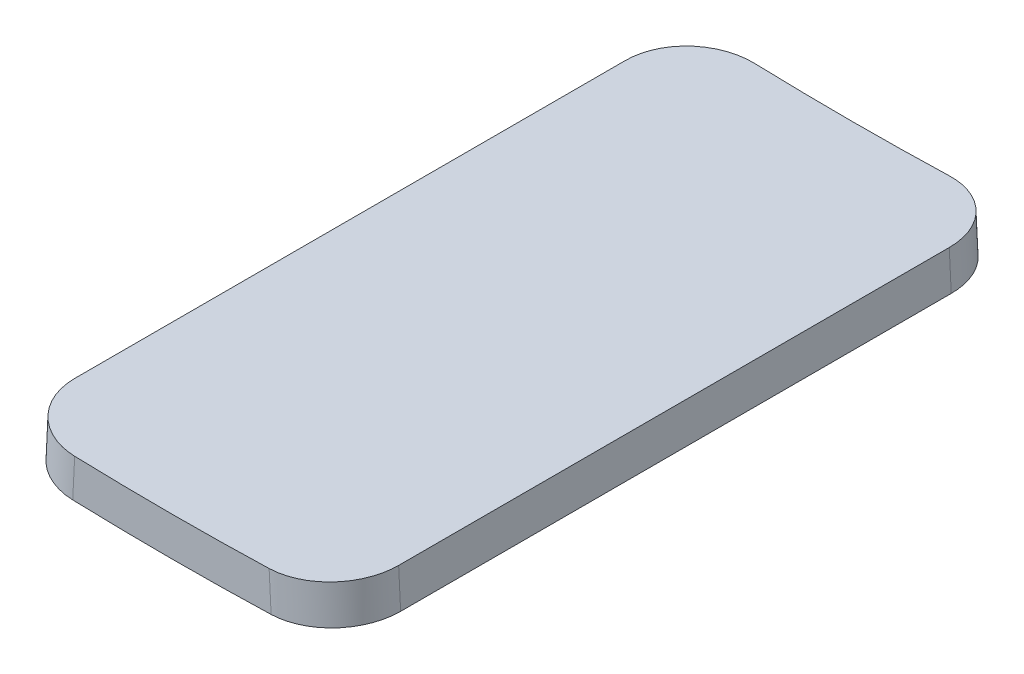
ISO-10303-21;
HEADER;
FILE_DESCRIPTION(('STEP AP214'),'2;1');
FILE_NAME('part.step','',(''),(''),'','','');
FILE_SCHEMA(('AUTOMOTIVE_DESIGN { 1 0 10303 214 1 1 1 1 }'));
ENDSEC;
DATA;
#1=APPLICATION_CONTEXT('core data for automotive mechanical design processes');
#2=APPLICATION_PROTOCOL_DEFINITION('international standard','automotive_design',2000,#1);
#3=PRODUCT_CONTEXT('',#1,'mechanical');
#4=PRODUCT('Part','Part','',(#3));
#5=PRODUCT_RELATED_PRODUCT_CATEGORY('part','',(#4));
#6=PRODUCT_DEFINITION_FORMATION('','',#4);
#7=PRODUCT_DEFINITION_CONTEXT('part definition',#1,'design');
#8=PRODUCT_DEFINITION('design','',#6,#7);
#9=PRODUCT_DEFINITION_SHAPE('','',#8);
#10=(LENGTH_UNIT() NAMED_UNIT(*) SI_UNIT(.MILLI.,.METRE.));
#11=(NAMED_UNIT(*) PLANE_ANGLE_UNIT() SI_UNIT($,.RADIAN.));
#12=(NAMED_UNIT(*) SI_UNIT($,.STERADIAN.) SOLID_ANGLE_UNIT());
#13=UNCERTAINTY_MEASURE_WITH_UNIT(LENGTH_MEASURE(1.E-05),#10,'distance_accuracy_value','');
#14=(GEOMETRIC_REPRESENTATION_CONTEXT(3) GLOBAL_UNCERTAINTY_ASSIGNED_CONTEXT((#13)) GLOBAL_UNIT_ASSIGNED_CONTEXT((#10,
#11,#12)) REPRESENTATION_CONTEXT('',''));
#15=CARTESIAN_POINT('',(0.,0.,0.));
#16=DIRECTION('',(0.,0.,1.));
#17=DIRECTION('',(1.,0.,0.));
#18=AXIS2_PLACEMENT_3D('',#15,#16,#17);
#19=CARTESIAN_POINT('',(0.,0.,105.));
#20=DIRECTION('',(0.,0.,-1.));
#21=DIRECTION('',(-1.,0.,0.));
#22=AXIS2_PLACEMENT_3D('',#19,#20,#21);
#23=CYLINDRICAL_SURFACE('',#22,989.5);
#24=DIRECTION('',(0.,0.,-1.));
#25=VECTOR('',#24,1.);
#26=CARTESIAN_POINT('',(-50.6138107416881,-988.204681309598,105.));
#27=LINE('',#26,#25);
#28=CARTESIAN_POINT('',(-50.6138107416881,-988.204681309598,85.));
#29=VERTEX_POINT('',#28);
#30=CARTESIAN_POINT('',(-50.6138107416881,-988.204681309598,-85.));
#31=VERTEX_POINT('',#30);
#32=EDGE_CURVE('E107',#29,#31,#27,.T.);
#33=ORIENTED_EDGE('',*,*,#32,.T.);
#34=CARTESIAN_POINT('',(-50.6138107416881,-988.204681309598,-85.));
#35=CARTESIAN_POINT('',(-50.6138110743106,-988.204681120901,-85.2812811827756));
#36=CARTESIAN_POINT('',(-50.6078838693653,-988.20498489261,-85.5625310707984));
#37=CARTESIAN_POINT('',(-50.5841914306772,-988.206198008476,-86.1245237497624));
#38=CARTESIAN_POINT('',(-50.566426479175,-988.207107338196,-86.4052665526338));
#39=CARTESIAN_POINT('',(-50.4954123886573,-988.210739537763,-87.2459428356075));
#40=CARTESIAN_POINT('',(-50.4244439947445,-988.214366620417,-87.8044700598129));
#41=CARTESIAN_POINT('',(-50.2358062973874,-988.223973933409,-88.9131267922659));
#42=CARTESIAN_POINT('',(-50.1181722773639,-988.229952385869,-89.4632623197968));
#43=CARTESIAN_POINT('',(-49.9073880214237,-988.240612136683,-90.2794063060949));
#44=CARTESIAN_POINT('',(-49.8314005890525,-988.244447590418,-90.5499552954991));
#45=CARTESIAN_POINT('',(-49.6680894953054,-988.252668894439,-91.0876771948021));
#46=CARTESIAN_POINT('',(-49.5807629334669,-988.257054885539,-91.354849221646));
#47=CARTESIAN_POINT('',(-49.3019621402565,-988.271016124019,-92.1506394129465));
#48=CARTESIAN_POINT('',(-49.0936861529881,-988.281393653225,-92.6734567905683));
#49=CARTESIAN_POINT('',(-48.6338593197196,-988.304128618946,-93.6996564824725));
#50=CARTESIAN_POINT('',(-48.3823084690021,-988.316486055676,-94.2030387946362));
#51=CARTESIAN_POINT('',(-47.9739545152395,-988.336363903036,-94.9407437770858));
#52=CARTESIAN_POINT('',(-47.8326513980132,-988.343214131934,-95.1837713908905));
#53=CARTESIAN_POINT('',(-47.5399753663873,-988.357335284709,-95.6635855702672));
#54=CARTESIAN_POINT('',(-47.3886050405922,-988.364606100377,-95.9003737185106));
#55=CARTESIAN_POINT('',(-46.9197003137813,-988.387014118973,-96.6008735043053));
#56=CARTESIAN_POINT('',(-46.5873449648487,-988.402748222839,-97.0547696039536));
#57=CARTESIAN_POINT('',(-45.885657051421,-988.43557189798,-97.9328486083196));
#58=CARTESIAN_POINT('',(-45.5163254773655,-988.452661432947,-98.3570323083921));
#59=CARTESIAN_POINT('',(-44.7432469406756,-988.487957196483,-99.1727665938462));
#60=CARTESIAN_POINT('',(-44.3394997948698,-988.506163430996,-99.5643170055204));
#61=CARTESIAN_POINT('',(-43.5003861337522,-988.543445061462,-100.312052020984));
#62=CARTESIAN_POINT('',(-43.0650133305269,-988.562520629978,-100.668229558319));
#63=CARTESIAN_POINT('',(-42.1658142487429,-988.601282910376,-101.342597906165));
#64=CARTESIAN_POINT('',(-41.7019884094727,-988.620969612821,-101.660789302922));
#65=CARTESIAN_POINT('',(-40.7491259768812,-988.660703224017,-102.256957918585));
#66=CARTESIAN_POINT('',(-40.2600868504971,-988.680750168828,-102.53493108623));
#67=CARTESIAN_POINT('',(-39.2602804586776,-988.720956916257,-103.048666050341));
#68=CARTESIAN_POINT('',(-38.749511864824,-988.741116725711,-103.284425261479));
#69=CARTESIAN_POINT('',(-37.7101813676001,-988.781301684371,-103.711927208893));
#70=CARTESIAN_POINT('',(-37.181628407264,-988.801326895359,-103.903691699949));
#71=CARTESIAN_POINT('',(-36.1103063080912,-988.841030131255,-104.241963788748));
#72=CARTESIAN_POINT('',(-35.5675406158332,-988.860708238433,-104.388482250368));
#73=CARTESIAN_POINT('',(-34.6595515354752,-988.892863524383,-104.59296020923));
#74=CARTESIAN_POINT('',(-34.2972354563729,-988.905497177651,-104.664060834218));
#75=CARTESIAN_POINT('',(-33.569217397896,-988.93047796715,-104.78608622626));
#76=CARTESIAN_POINT('',(-33.2035156803012,-988.942825125279,-104.837012540091));
#77=CARTESIAN_POINT('',(-32.4703949132317,-988.967167131276,-104.91846887819));
#78=CARTESIAN_POINT('',(-32.102979239186,-988.979162477203,-104.94902921383));
#79=CARTESIAN_POINT('',(-31.3669300378475,-989.002781478952,-104.989802241677));
#80=CARTESIAN_POINT('',(-30.9982962672498,-989.014405054855,-105.000010587485));
#81=CARTESIAN_POINT('',(-30.6296522270059,-989.025820898753,-105.));
#82=B_SPLINE_CURVE_WITH_KNOTS('',3,(#34,#35,#36,#37,#38,#39,#40,#41,#42,#43,#44,#45,#46,#47,#48,
#49,#50,#51,#52,#53,#54,#55,#56,#57,#58,#59,#60,#61,#62,#63,#64,#65,#66,#67,#68,#69,#70,#71,#72,
#73,#74,#75,#76,#77,#78,#79,#80,#81),.UNSPECIFIED.,.F.,.F.,(4,2,2,2,2,2,2,2,2,2,2,2,2,2,2,2,2,2,
2,2,2,2,2,4),(0.,0.843718471571636,1.68741682757384,3.37437735259959,5.06006480698462,
5.90297747443505,6.74610617880925,8.43259492446783,10.1190838539707,10.9624773354436,
11.8056547854397,13.4918417340963,15.1779835288756,16.864134298436,18.5506212363113,
20.237082142943,21.9237128119545,23.6104467407432,25.2963447965282,26.9818377414643,
28.0896527338091,29.1973827729266,30.3034604360285,31.4097742893419),.UNSPECIFIED.);
#83=CARTESIAN_POINT('',(-30.6296522270059,-989.025820898753,-105.));
#84=VERTEX_POINT('',#83);
#85=EDGE_CURVE('E103',#31,#84,#82,.T.);
#86=ORIENTED_EDGE('',*,*,#85,.T.);
#87=CARTESIAN_POINT('',(0.,0.,-105.));
#88=DIRECTION('',(0.,0.,1.));
#89=DIRECTION('',(1.,0.,0.));
#90=AXIS2_PLACEMENT_3D('',#87,#88,#89);
#91=CIRCLE('',#90,989.5);
#92=CARTESIAN_POINT('',(30.6296522270056,-989.025820898753,-105.));
#93=VERTEX_POINT('',#92);
#94=EDGE_CURVE('E105',#84,#93,#91,.T.);
#95=ORIENTED_EDGE('',*,*,#94,.T.);
#96=CARTESIAN_POINT('',(30.6296522270056,-989.025820898753,-105.));
#97=CARTESIAN_POINT('',(30.9107942760311,-989.017114243523,-105.000000341952));
#98=CARTESIAN_POINT('',(31.1919013503822,-989.008288287906,-104.994067965196));
#99=CARTESIAN_POINT('',(31.7536014979424,-988.990413347455,-104.970354294083));
#100=CARTESIAN_POINT('',(32.0341945831384,-988.981364367895,-104.952573279673));
#101=CARTESIAN_POINT('',(32.8744126496671,-988.953910331833,-104.881493827701));
#102=CARTESIAN_POINT('',(33.4326215124079,-988.935193683377,-104.810458963153));
#103=CARTESIAN_POINT('',(34.5406202155872,-988.897114277602,-104.62163974855));
#104=CARTESIAN_POINT('',(35.0904160748013,-988.877752017039,-104.503890614928));
#105=CARTESIAN_POINT('',(35.9060358972286,-988.84836084814,-104.292896919782));
#106=CARTESIAN_POINT('',(36.1764076577185,-988.838505420839,-104.216833562174));
#107=CARTESIAN_POINT('',(36.7137706330595,-988.818699938255,-104.053358474429));
#108=CARTESIAN_POINT('',(36.9807609635702,-988.808749859362,-103.965943840232));
#109=CARTESIAN_POINT('',(37.7760034976412,-988.778794678208,-103.686859660725));
#110=CARTESIAN_POINT('',(38.2984488040313,-988.75868746317,-103.478370138696));
#111=CARTESIAN_POINT('',(39.3238923801936,-988.718435577472,-103.018071338675));
#112=CARTESIAN_POINT('',(39.8268906483694,-988.698290906809,-102.766262057126));
#113=CARTESIAN_POINT('',(40.5640139264377,-988.66823119018,-102.357491137755));
#114=CARTESIAN_POINT('',(40.8068464390108,-988.658236633878,-102.216044294069));
#115=CARTESIAN_POINT('',(41.2862694867135,-988.638331996537,-101.923071808685));
#116=CARTESIAN_POINT('',(41.5228616049426,-988.628421894515,-101.771548758201));
#117=CARTESIAN_POINT('',(42.2227729156166,-988.598859693273,-101.302173547109));
#118=CARTESIAN_POINT('',(42.6762761992155,-988.579373689636,-100.969488070956));
#119=CARTESIAN_POINT('',(43.5535360030886,-988.54111315165,-100.267146348031));
#120=CARTESIAN_POINT('',(43.9772959976923,-988.522338534323,-99.8974944316009));
#121=CARTESIAN_POINT('',(44.7922025937069,-988.48574847995,-99.1237637088478));
#122=CARTESIAN_POINT('',(45.1833490232097,-988.467933047959,-98.7196847210798));
#123=CARTESIAN_POINT('',(45.9303053067172,-988.433506577917,-97.8799017432685));
#124=CARTESIAN_POINT('',(46.2861080166182,-988.416895783545,-97.4441913901892));
#125=CARTESIAN_POINT('',(46.9597635248392,-988.385119452295,-96.5443187860333));
#126=CARTESIAN_POINT('',(47.277616904084,-988.369953893296,-96.0801569706537));
#127=CARTESIAN_POINT('',(47.873189524453,-988.341285523332,-95.1265727966909));
#128=CARTESIAN_POINT('',(48.1508999315917,-988.327783078455,-94.6371449100408));
#129=CARTESIAN_POINT('',(48.6641503207358,-988.302644200415,-93.6365677331958));
#130=CARTESIAN_POINT('',(48.8996877162629,-988.291007881707,-93.125417113119));
#131=CARTESIAN_POINT('',(49.3267911095546,-988.2697826981,-92.0853353087322));
#132=CARTESIAN_POINT('',(49.5183789197541,-988.260192817707,-91.556413094659));
#133=CARTESIAN_POINT('',(49.856345721859,-988.243200577405,-90.4843682550159));
#134=CARTESIAN_POINT('',(50.0027355660232,-988.235797692408,-89.9412490722327));
#135=CARTESIAN_POINT('',(50.2070502670356,-988.22543408714,-89.0326470987122));
#136=CARTESIAN_POINT('',(50.2781000831595,-988.221820428882,-88.6700656053341));
#137=CARTESIAN_POINT('',(50.4000395743948,-988.21560893616,-87.9415253263527));
#138=CARTESIAN_POINT('',(50.450930796011,-988.213011023771,-87.5755668020299));
#139=CARTESIAN_POINT('',(50.5323321251638,-988.208851992709,-86.8419415459166));
#140=CARTESIAN_POINT('',(50.5628724557503,-988.207289336601,-86.4742781674176));
#141=CARTESIAN_POINT('',(50.6036192121511,-988.205203278103,-85.7377446577922));
#142=CARTESIAN_POINT('',(50.6138212861946,-988.20468009813,-85.3688742853141));
#143=CARTESIAN_POINT('',(50.6138107416878,-988.204681309598,-85.));
#144=B_SPLINE_CURVE_WITH_KNOTS('',3,(#96,#97,#98,#99,#100,#101,#102,#103,#104,#105,#106,#107,
#108,#109,#110,#111,#112,#113,#114,#115,#116,#117,#118,#119,#120,#121,#122,#123,#124,#125,#126,
#127,#128,#129,#130,#131,#132,#133,#134,#135,#136,#137,#138,#139,#140,#141,#142,#143),
.UNSPECIFIED.,.F.,.F.,(4,2,2,2,2,2,2,2,2,2,2,2,2,2,2,2,2,2,2,2,2,2,2,4),(0.,0.843705499755149,
1.68739106594493,3.37432819283306,5.05999599950946,5.90289848387437,6.74601703908519,
8.43249658004626,10.1189762594649,10.9623633670642,11.8055344203905,13.4917083952577,
15.177685078317,16.8636706476943,18.5499963185203,20.2362961719196,21.9229665545133,
23.6097403454943,25.295675160827,26.9812048593613,28.0891764171013,29.1970629582343,
30.3033004914317,31.4097747005641),.UNSPECIFIED.);
#145=CARTESIAN_POINT('',(50.6138107416878,-988.204681309598,-85.));
#146=VERTEX_POINT('',#145);
#147=EDGE_CURVE('E112',#93,#146,#144,.T.);
#148=ORIENTED_EDGE('',*,*,#147,.T.);
#149=DIRECTION('',(0.,0.,-1.));
#150=VECTOR('',#149,1.);
#151=CARTESIAN_POINT('',(50.6138107416878,-988.204681309598,105.));
#152=LINE('',#151,#150);
#153=CARTESIAN_POINT('',(50.6138107416878,-988.204681309598,85.));
#154=VERTEX_POINT('',#153);
#155=EDGE_CURVE('E131',#154,#146,#152,.T.);
#156=ORIENTED_EDGE('',*,*,#155,.F.);
#157=CARTESIAN_POINT('',(50.6138107416878,-988.204681309598,85.));
#158=CARTESIAN_POINT('',(50.6138110743103,-988.204681120901,85.2812811827756));
#159=CARTESIAN_POINT('',(50.6078838693649,-988.20498489261,85.5625310707984));
#160=CARTESIAN_POINT('',(50.5841914306769,-988.206198008476,86.1245237497624));
#161=CARTESIAN_POINT('',(50.5664264791746,-988.207107338196,86.4052665526337));
#162=CARTESIAN_POINT('',(50.495412388657,-988.210739537763,87.2459428356075));
#163=CARTESIAN_POINT('',(50.4244439947442,-988.214366620418,87.8044700598128));
#164=CARTESIAN_POINT('',(50.235806297387,-988.223973933409,88.9131267922658));
#165=CARTESIAN_POINT('',(50.1181722773635,-988.229952385869,89.4632623197967));
#166=CARTESIAN_POINT('',(49.9073880214234,-988.240612136683,90.2794063060948));
#167=CARTESIAN_POINT('',(49.8314005890522,-988.244447590418,90.5499552954991));
#168=CARTESIAN_POINT('',(49.668089495305,-988.252668894439,91.0876771948021));
#169=CARTESIAN_POINT('',(49.5807629334666,-988.257054885539,91.354849221646));
#170=CARTESIAN_POINT('',(49.3019621402561,-988.271016124019,92.1506394129465));
#171=CARTESIAN_POINT('',(49.0936861529877,-988.281393653225,92.6734567905683));
#172=CARTESIAN_POINT('',(48.6338593197192,-988.304128618946,93.6996564824725));
#173=CARTESIAN_POINT('',(48.3823084690018,-988.316486055676,94.2030387946362));
#174=CARTESIAN_POINT('',(47.9739545152391,-988.336363903036,94.9407437770858));
#175=CARTESIAN_POINT('',(47.8326513980129,-988.343214131934,95.1837713908906));
#176=CARTESIAN_POINT('',(47.5399753663869,-988.357335284709,95.6635855702672));
#177=CARTESIAN_POINT('',(47.3886050405918,-988.364606100377,95.9003737185106));
#178=CARTESIAN_POINT('',(46.9197003137809,-988.387014118973,96.6008735043053));
#179=CARTESIAN_POINT('',(46.5873449648484,-988.402748222839,97.0547696039536));
#180=CARTESIAN_POINT('',(45.8856570514206,-988.43557189798,97.9328486083196));
#181=CARTESIAN_POINT('',(45.5163254773651,-988.452661432947,98.3570323083921));
#182=CARTESIAN_POINT('',(44.7432469406753,-988.487957196483,99.1727665938462));
#183=CARTESIAN_POINT('',(44.3394997948695,-988.506163430996,99.5643170055204));
#184=CARTESIAN_POINT('',(43.5003861337519,-988.543445061462,100.312052020984));
#185=CARTESIAN_POINT('',(43.0650133305265,-988.562520629978,100.668229558319));
#186=CARTESIAN_POINT('',(42.1658142487425,-988.601282910376,101.342597906165));
#187=CARTESIAN_POINT('',(41.7019884094724,-988.620969612821,101.660789302922));
#188=CARTESIAN_POINT('',(40.7491259768809,-988.660703224017,102.256957918585));
#189=CARTESIAN_POINT('',(40.2600868504967,-988.680750168828,102.53493108623));
#190=CARTESIAN_POINT('',(39.2602804586773,-988.720956916257,103.048666050341));
#191=CARTESIAN_POINT('',(38.7495118648236,-988.741116725711,103.284425261479));
#192=CARTESIAN_POINT('',(37.7101813675998,-988.781301684371,103.711927208893));
#193=CARTESIAN_POINT('',(37.1816284072637,-988.801326895359,103.903691699949));
#194=CARTESIAN_POINT('',(36.1103063080908,-988.841030131255,104.241963788748));
#195=CARTESIAN_POINT('',(35.5675406158328,-988.860708238433,104.388482250368));
#196=CARTESIAN_POINT('',(34.6595515354749,-988.892863524383,104.59296020923));
#197=CARTESIAN_POINT('',(34.2972354563725,-988.905497177651,104.664060834218));
#198=CARTESIAN_POINT('',(33.5692173978956,-988.93047796715,104.78608622626));
#199=CARTESIAN_POINT('',(33.2035156803008,-988.942825125279,104.837012540091));
#200=CARTESIAN_POINT('',(32.4703949132313,-988.967167131276,104.91846887819));
#201=CARTESIAN_POINT('',(32.1029792391856,-988.979162477203,104.94902921383));
#202=CARTESIAN_POINT('',(31.3669300378471,-989.002781478952,104.989802241677));
#203=CARTESIAN_POINT('',(30.9982962672495,-989.014405054855,105.000010587485));
#204=CARTESIAN_POINT('',(30.6296522270056,-989.025820898753,105.));
#205=B_SPLINE_CURVE_WITH_KNOTS('',3,(#157,#158,#159,#160,#161,#162,#163,#164,#165,#166,#167,
#168,#169,#170,#171,#172,#173,#174,#175,#176,#177,#178,#179,#180,#181,#182,#183,#184,#185,#186,
#187,#188,#189,#190,#191,#192,#193,#194,#195,#196,#197,#198,#199,#200,#201,#202,#203,#204),
.UNSPECIFIED.,.F.,.F.,(4,2,2,2,2,2,2,2,2,2,2,2,2,2,2,2,2,2,2,2,2,2,2,4),(0.,0.843718471571636,
1.68741682757383,3.37437735259958,5.0600648069846,5.90297747443504,6.74610617880925,
8.43259492446784,10.1190838539707,10.9624773354437,11.8056547854397,13.4918417340963,
15.1779835288756,16.864134298436,18.5506212363113,20.237082142943,21.9237128119545,
23.6104467407432,25.2963447965282,26.9818377414643,28.0896527338091,29.1973827729266,
30.3034604360285,31.4097742893419),.UNSPECIFIED.);
#206=CARTESIAN_POINT('',(30.6296522270056,-989.025820898753,105.));
#207=VERTEX_POINT('',#206);
#208=EDGE_CURVE('E54',#154,#207,#205,.T.);
#209=ORIENTED_EDGE('',*,*,#208,.T.);
#210=CARTESIAN_POINT('',(0.,0.,105.));
#211=DIRECTION('',(0.,0.,1.));
#212=DIRECTION('',(1.,0.,0.));
#213=AXIS2_PLACEMENT_3D('',#210,#211,#212);
#214=CIRCLE('',#213,989.5);
#215=CARTESIAN_POINT('',(-30.6296522270059,-989.025820898753,105.));
#216=VERTEX_POINT('',#215);
#217=EDGE_CURVE('E233',#216,#207,#214,.T.);
#218=ORIENTED_EDGE('',*,*,#217,.F.);
#219=CARTESIAN_POINT('',(-30.629652227006,-989.025820898753,105.));
#220=CARTESIAN_POINT('',(-30.9107942760315,-989.017114243523,105.000000341952));
#221=CARTESIAN_POINT('',(-31.1919013503826,-989.008288287906,104.994067965196));
#222=CARTESIAN_POINT('',(-31.7536014979427,-988.990413347455,104.970354294083));
#223=CARTESIAN_POINT('',(-32.0341945831387,-988.981364367895,104.952573279673));
#224=CARTESIAN_POINT('',(-32.8744126496674,-988.953910331833,104.881493827701));
#225=CARTESIAN_POINT('',(-33.4326215124083,-988.935193683377,104.810458963153));
#226=CARTESIAN_POINT('',(-34.5406202155875,-988.897114277602,104.62163974855));
#227=CARTESIAN_POINT('',(-35.0904160748017,-988.877752017039,104.503890614928));
#228=CARTESIAN_POINT('',(-35.9060358972289,-988.84836084814,104.292896919782));
#229=CARTESIAN_POINT('',(-36.1764076577189,-988.838505420839,104.216833562174));
#230=CARTESIAN_POINT('',(-36.7137706330598,-988.818699938255,104.053358474429));
#231=CARTESIAN_POINT('',(-36.9807609635705,-988.808749859362,103.965943840232));
#232=CARTESIAN_POINT('',(-37.7760034976416,-988.778794678208,103.686859660725));
#233=CARTESIAN_POINT('',(-38.2984488040316,-988.75868746317,103.478370138696));
#234=CARTESIAN_POINT('',(-39.323892380194,-988.718435577472,103.018071338675));
#235=CARTESIAN_POINT('',(-39.8268906483697,-988.698290906809,102.766262057126));
#236=CARTESIAN_POINT('',(-40.564013926438,-988.66823119018,102.357491137755));
#237=CARTESIAN_POINT('',(-40.8068464390112,-988.658236633878,102.216044294069));
#238=CARTESIAN_POINT('',(-41.2862694867139,-988.638331996537,101.923071808685));
#239=CARTESIAN_POINT('',(-41.522861604943,-988.628421894515,101.771548758201));
#240=CARTESIAN_POINT('',(-42.222772915617,-988.598859693273,101.302173547109));
#241=CARTESIAN_POINT('',(-42.6762761992158,-988.579373689636,100.969488070956));
#242=CARTESIAN_POINT('',(-43.5535360030889,-988.54111315165,100.267146348031));
#243=CARTESIAN_POINT('',(-43.9772959976927,-988.522338534323,99.8974944316009));
#244=CARTESIAN_POINT('',(-44.7922025937072,-988.48574847995,99.1237637088478));
#245=CARTESIAN_POINT('',(-45.1833490232101,-988.467933047959,98.7196847210798));
#246=CARTESIAN_POINT('',(-45.9303053067176,-988.433506577917,97.8799017432685));
#247=CARTESIAN_POINT('',(-46.2861080166186,-988.416895783545,97.4441913901892));
#248=CARTESIAN_POINT('',(-46.9597635248396,-988.385119452295,96.5443187860333));
#249=CARTESIAN_POINT('',(-47.2776169040844,-988.369953893296,96.0801569706537));
#250=CARTESIAN_POINT('',(-47.8731895244533,-988.341285523332,95.1265727966909));
#251=CARTESIAN_POINT('',(-48.1508999315921,-988.327783078455,94.6371449100408));
#252=CARTESIAN_POINT('',(-48.6641503207362,-988.302644200415,93.6365677331958));
#253=CARTESIAN_POINT('',(-48.8996877162632,-988.291007881707,93.125417113119));
#254=CARTESIAN_POINT('',(-49.3267911095549,-988.2697826981,92.0853353087322));
#255=CARTESIAN_POINT('',(-49.5183789197545,-988.260192817706,91.556413094659));
#256=CARTESIAN_POINT('',(-49.8563457218593,-988.243200577405,90.484368255016));
#257=CARTESIAN_POINT('',(-50.0027355660236,-988.235797692408,89.9412490722327));
#258=CARTESIAN_POINT('',(-50.2070502670359,-988.22543408714,89.0326470987122));
#259=CARTESIAN_POINT('',(-50.2781000831599,-988.221820428882,88.6700656053341));
#260=CARTESIAN_POINT('',(-50.4000395743952,-988.21560893616,87.9415253263528));
#261=CARTESIAN_POINT('',(-50.4509307960113,-988.213011023771,87.5755668020299));
#262=CARTESIAN_POINT('',(-50.5323321251642,-988.208851992709,86.8419415459166));
#263=CARTESIAN_POINT('',(-50.5628724557506,-988.2072893366,86.4742781674176));
#264=CARTESIAN_POINT('',(-50.6036192121515,-988.205203278102,85.7377446577922));
#265=CARTESIAN_POINT('',(-50.6138212861949,-988.20468009813,85.3688742853141));
#266=CARTESIAN_POINT('',(-50.6138107416881,-988.204681309598,85.));
#267=B_SPLINE_CURVE_WITH_KNOTS('',3,(#219,#220,#221,#222,#223,#224,#225,#226,#227,#228,#229,
#230,#231,#232,#233,#234,#235,#236,#237,#238,#239,#240,#241,#242,#243,#244,#245,#246,#247,#248,
#249,#250,#251,#252,#253,#254,#255,#256,#257,#258,#259,#260,#261,#262,#263,#264,#265,#266),
.UNSPECIFIED.,.F.,.F.,(4,2,2,2,2,2,2,2,2,2,2,2,2,2,2,2,2,2,2,2,2,2,2,4),(0.,0.843705499755156,
1.68739106594493,3.37432819283305,5.05999599950946,5.90289848387437,6.74601703908519,
8.43249658004626,10.1189762594649,10.9623633670642,11.8055344203905,13.4917083952577,
15.177685078317,16.8636706476943,18.5499963185203,20.2362961719196,21.9229665545133,
23.6097403454943,25.295675160827,26.9812048593613,28.0891764171013,29.1970629582343,
30.3033004914317,31.4097747005641),.UNSPECIFIED.);
#268=EDGE_CURVE('E185',#216,#29,#267,.T.);
#269=ORIENTED_EDGE('',*,*,#268,.T.);
#270=EDGE_LOOP('',(#33,#86,#95,#148,#156,#209,#218,#269));
#271=FACE_BOUND('',#270,.T.);
#272=ADVANCED_FACE('F38',(#271),#23,.T.);
#273=CARTESIAN_POINT('',(49.9999999999998,-976.22039007593,105.));
#274=DIRECTION('',(0.998690936139058,0.051150895140665,0.));
#275=DIRECTION('',(-0.051150895140665,0.998690936139058,0.));
#276=AXIS2_PLACEMENT_3D('',#273,#274,#275);
#277=PLANE('',#276);
#278=ORIENTED_EDGE('',*,*,#155,.T.);
#279=DIRECTION('',(0.051150895140665,-0.998690936139058,0.));
#280=VECTOR('',#279,1.);
#281=CARTESIAN_POINT('',(49.9999999999998,-976.22039007593,-85.));
#282=LINE('',#281,#280);
#283=CARTESIAN_POINT('',(49.9999999999998,-976.22039007593,-85.));
#284=VERTEX_POINT('',#283);
#285=EDGE_CURVE('E226',#146,#284,#282,.F.);
#286=ORIENTED_EDGE('',*,*,#285,.T.);
#287=DIRECTION('',(0.,0.,-1.));
#288=VECTOR('',#287,1.);
#289=CARTESIAN_POINT('',(49.9999999999998,-976.22039007593,105.));
#290=LINE('',#289,#288);
#291=CARTESIAN_POINT('',(49.9999999999998,-976.22039007593,85.));
#292=VERTEX_POINT('',#291);
#293=EDGE_CURVE('E214',#292,#284,#290,.T.);
#294=ORIENTED_EDGE('',*,*,#293,.F.);
#295=DIRECTION('',(0.051150895140665,-0.998690936139058,0.));
#296=VECTOR('',#295,1.);
#297=CARTESIAN_POINT('',(49.9999999999998,-976.22039007593,85.));
#298=LINE('',#297,#296);
#299=EDGE_CURVE('E111',#292,#154,#298,.T.);
#300=ORIENTED_EDGE('',*,*,#299,.T.);
#301=EDGE_LOOP('',(#278,#286,#294,#300));
#302=FACE_BOUND('',#301,.T.);
#303=ADVANCED_FACE('F151',(#302),#277,.T.);
#304=CARTESIAN_POINT('',(0.,0.,105.));
#305=DIRECTION('',(0.,0.,-1.));
#306=DIRECTION('',(-1.,0.,0.));
#307=AXIS2_PLACEMENT_3D('',#304,#305,#306);
#308=CYLINDRICAL_SURFACE('',#307,977.5);
#309=CARTESIAN_POINT('',(0.,0.,-105.));
#310=DIRECTION('',(0.,0.,1.));
#311=DIRECTION('',(1.,0.,0.));
#312=AXIS2_PLACEMENT_3D('',#309,#310,#311);
#313=CIRCLE('',#312,977.5);
#314=CARTESIAN_POINT('',(-30.0157145253953,-977.03905084778,-105.));
#315=VERTEX_POINT('',#314);
#316=CARTESIAN_POINT('',(30.0157145253949,-977.03905084778,-105.));
#317=VERTEX_POINT('',#316);
#318=EDGE_CURVE('E123',#315,#317,#313,.T.);
#319=ORIENTED_EDGE('',*,*,#318,.F.);
#320=CARTESIAN_POINT('',(-30.0157145253953,-977.03905084778,-105.));
#321=CARTESIAN_POINT('',(-30.2968585912549,-977.030413973269,-105.000000341954));
#322=CARTESIAN_POINT('',(-30.5779676674391,-977.021656313349,-104.994068030789));
#323=CARTESIAN_POINT('',(-31.1396717902263,-977.003914906172,-104.970354606603));
#324=CARTESIAN_POINT('',(-31.4202668488143,-976.99493116426,-104.952573773466));
#325=CARTESIAN_POINT('',(-32.2604908079598,-976.967668093616,-104.88149501415));
#326=CARTESIAN_POINT('',(-32.8187035451804,-976.949072461947,-104.810460809843));
#327=CARTESIAN_POINT('',(-33.926709895628,-976.911221875875,-104.621643186494));
#328=CARTESIAN_POINT('',(-34.4765095271596,-976.891967428051,-104.50389498031));
#329=CARTESIAN_POINT('',(-35.292134870937,-976.862728013598,-104.292902801362));
#330=CARTESIAN_POINT('',(-35.5625084476787,-976.852921512176,-104.216839970515));
#331=CARTESIAN_POINT('',(-36.0998750068221,-976.833210597489,-104.053365967024));
#332=CARTESIAN_POINT('',(-36.3668671048662,-976.823306159769,-103.965951890312));
#333=CARTESIAN_POINT('',(-37.1621149502017,-976.793483013809,-103.68686938242));
#334=CARTESIAN_POINT('',(-37.6845637164111,-976.773457293236,-103.47838099735));
#335=CARTESIAN_POINT('',(-38.7100139450433,-976.733355723791,-103.018084472519));
#336=CARTESIAN_POINT('',(-39.2130154058948,-976.713279874914,-102.766276329256));
#337=CARTESIAN_POINT('',(-39.950143236102,-976.683314409576,-102.35750709315));
#338=CARTESIAN_POINT('',(-40.192977221124,-976.673349775926,-102.216060810307));
#339=CARTESIAN_POINT('',(-40.6724031369494,-976.653502100009,-101.923089433863));
#340=CARTESIAN_POINT('',(-40.9089966508759,-976.643619037492,-101.771566931485));
#341=CARTESIAN_POINT('',(-41.6089120308345,-976.614133821359,-101.302193341876));
#342=CARTESIAN_POINT('',(-42.0624178722127,-976.59469363606,-100.969508915434));
#343=CARTESIAN_POINT('',(-42.9396813157002,-976.556514830303,-100.26717014849));
#344=CARTESIAN_POINT('',(-43.3634424708426,-976.537776126178,-99.8975202363879));
#345=CARTESIAN_POINT('',(-44.178351275181,-976.501249174579,-99.1237936197078));
#346=CARTESIAN_POINT('',(-44.5694987525236,-976.483460932114,-98.7197167337447));
#347=CARTESIAN_POINT('',(-45.3164570799479,-976.449081411399,-97.8799380266192));
#348=CARTESIAN_POINT('',(-45.6722607852816,-976.43249037535,-97.4442298418725));
#349=CARTESIAN_POINT('',(-46.34591828704,-976.400747440982,-96.5443616227274));
#350=CARTESIAN_POINT('',(-46.6637726643143,-976.385595520638,-96.0802020239687));
#351=CARTESIAN_POINT('',(-47.2593476915321,-976.356949584232,-95.1266217554342));
#352=CARTESIAN_POINT('',(-47.5370594611326,-976.343455935111,-94.6371955285775));
#353=CARTESIAN_POINT('',(-48.0503126052022,-976.318331037088,-93.6366216182411));
#354=CARTESIAN_POINT('',(-48.2858513932534,-976.306699902416,-93.1254726049063));
#355=CARTESIAN_POINT('',(-48.7129576570534,-976.285482567547,-92.0853939269528));
#356=CARTESIAN_POINT('',(-48.9045469442786,-976.27589535315,-91.556473232231));
#357=CARTESIAN_POINT('',(-49.242516823067,-976.258906865196,-90.4844313308715));
#358=CARTESIAN_POINT('',(-49.3889082664827,-976.251505066947,-89.9413135669239));
#359=CARTESIAN_POINT('',(-49.5932271154578,-976.241142493958,-89.0327077385108));
#360=CARTESIAN_POINT('',(-49.6642790991348,-976.23752903765,-88.6701209329766));
#361=CARTESIAN_POINT('',(-49.7862223097253,-976.231317773875,-87.9415698753802));
#362=CARTESIAN_POINT('',(-49.8371150831529,-976.228719888498,-87.5756058846037));
#363=CARTESIAN_POINT('',(-49.918518896418,-976.224560855775,-86.8419695850398));
#364=CARTESIAN_POINT('',(-49.9490601593665,-976.22299817112,-86.4743006296017));
#365=CARTESIAN_POINT('',(-49.9898081594526,-976.220912060108,-85.7377559146505));
#366=CARTESIAN_POINT('',(-50.0000105447619,-976.220388856164,-85.368879913779));
#367=CARTESIAN_POINT('',(-50.0000000000001,-976.22039007593,-85.));
#368=B_SPLINE_CURVE_WITH_KNOTS('',3,(#320,#321,#322,#323,#324,#325,#326,#327,#328,#329,#330,
#331,#332,#333,#334,#335,#336,#337,#338,#339,#340,#341,#342,#343,#344,#345,#346,#347,#348,#349,
#350,#351,#352,#353,#354,#355,#356,#357,#358,#359,#360,#361,#362,#363,#364,#365,#366,#367),
.UNSPECIFIED.,.F.,.F.,(4,2,2,2,2,2,2,2,2,2,2,2,2,2,2,2,2,2,2,2,2,2,2,4),(0.,0.843705095209081,
1.68739026133242,3.3743266428134,5.05999382610245,5.90289598977293,6.74601422534186,
8.43249341140294,10.1189727337254,10.962359622605,11.8055304567178,13.4917039873887,
15.1776757589302,16.8636564139028,18.5499771994424,20.2362721709784,21.9229396154478,
23.6097104657843,25.29564237725,26.9811691867014,28.0891576011049,29.1970609996857,
30.3033154121959,31.4098065001446),.UNSPECIFIED.);
#369=CARTESIAN_POINT('',(-50.0000000000001,-976.22039007593,-85.));
#370=VERTEX_POINT('',#369);
#371=EDGE_CURVE('E126',#315,#370,#368,.T.);
#372=ORIENTED_EDGE('',*,*,#371,.T.);
#373=DIRECTION('',(0.,0.,-1.));
#374=VECTOR('',#373,1.);
#375=CARTESIAN_POINT('',(-50.0000000000001,-976.22039007593,105.));
#376=LINE('',#375,#374);
#377=CARTESIAN_POINT('',(-50.0000000000001,-976.22039007593,85.));
#378=VERTEX_POINT('',#377);
#379=EDGE_CURVE('E213',#378,#370,#376,.T.);
#380=ORIENTED_EDGE('',*,*,#379,.F.);
#381=CARTESIAN_POINT('',(-50.0000000000001,-976.22039007593,85.));
#382=CARTESIAN_POINT('',(-50.0000003325151,-976.220389885131,85.2812811547119));
#383=CARTESIAN_POINT('',(-49.9940731288733,-976.220693659135,85.5625310146811));
#384=CARTESIAN_POINT('',(-49.9703806946833,-976.221906770326,86.124523637683));
#385=CARTESIAN_POINT('',(-49.9526157463758,-976.222816093075,86.4052664126458));
#386=CARTESIAN_POINT('',(-49.8816016668581,-976.226448230747,87.2459426125955));
#387=CARTESIAN_POINT('',(-49.810633282167,-976.230075217516,87.8044697821019));
#388=CARTESIAN_POINT('',(-49.6219955864516,-976.239681863579,88.9131264171736));
#389=CARTESIAN_POINT('',(-49.5043615580503,-976.245659745396,89.4632619018823));
#390=CARTESIAN_POINT('',(-49.2935772533981,-976.256317826917,90.2794058259908));
#391=CARTESIAN_POINT('',(-49.2175897987705,-976.26015258862,90.5499547949855));
#392=CARTESIAN_POINT('',(-49.0542786433772,-976.268372138456,91.0876766542349));
#393=CARTESIAN_POINT('',(-48.9669520421415,-976.272757067308,91.3548486614339));
#394=CARTESIAN_POINT('',(-48.6881510958288,-976.286714405425,92.1506387980945));
#395=CARTESIAN_POINT('',(-48.4798749608174,-976.297088382947,92.6734561416514));
#396=CARTESIAN_POINT('',(-48.0200476916956,-976.319813348709,93.6996557663378));
#397=CARTESIAN_POINT('',(-47.7684965528953,-976.332164337164,94.203038045361));
#398=CARTESIAN_POINT('',(-47.3601420199318,-976.352029481556,94.9407429770854));
#399=CARTESIAN_POINT('',(-47.2188386848171,-976.3588749705,95.183770574234));
#400=CARTESIAN_POINT('',(-46.9261621614496,-976.372985479279,95.6635847189653));
#401=CARTESIAN_POINT('',(-46.7747915618152,-976.380250391205,95.9003728492194));
#402=CARTESIAN_POINT('',(-46.3058859189081,-976.402638713051,96.60087257771));
#403=CARTESIAN_POINT('',(-45.9735298328904,-976.418357037616,97.0547686350916));
#404=CARTESIAN_POINT('',(-45.2718402880595,-976.451142553049,97.9328473536376));
#405=CARTESIAN_POINT('',(-44.9025078352628,-976.468209707217,98.3570308226592));
#406=CARTESIAN_POINT('',(-44.1294272193529,-976.503452795963,99.1727646498289));
#407=CARTESIAN_POINT('',(-43.7256788730808,-976.521628736441,99.5643148342832));
#408=CARTESIAN_POINT('',(-42.8865624708597,-976.558840586191,100.312049380699));
#409=CARTESIAN_POINT('',(-42.4511881281954,-976.577876666158,100.668226677633));
#410=CARTESIAN_POINT('',(-41.5519855940227,-976.616549601898,101.34259454995));
#411=CARTESIAN_POINT('',(-41.0881578418401,-976.636186448392,101.660785711623));
#412=CARTESIAN_POINT('',(-40.1352920602815,-976.675808903604,102.256953341406));
#413=CARTESIAN_POINT('',(-39.6462515427768,-976.695794546614,102.534925830183));
#414=CARTESIAN_POINT('',(-38.646442081927,-976.735866434897,103.048659633838));
#415=CARTESIAN_POINT('',(-38.1356718102224,-976.755952686255,103.284418363548));
#416=CARTESIAN_POINT('',(-37.0963376447691,-976.795977710534,103.711919613856));
#417=CARTESIAN_POINT('',(-36.5677826930006,-976.815916551599,103.903683886209));
#418=CARTESIAN_POINT('',(-35.4964563448641,-976.855433868423,104.241955855291));
#419=CARTESIAN_POINT('',(-34.9536883950186,-976.87501242962,104.388474415446));
#420=CARTESIAN_POINT('',(-34.0456903310938,-976.906991998192,104.592954007876));
#421=CARTESIAN_POINT('',(-33.6833675358384,-976.919553219534,104.664055773076));
#422=CARTESIAN_POINT('',(-32.9553358608511,-976.944383499095,104.786083083087));
#423=CARTESIAN_POINT('',(-32.5896272429027,-976.956652579644,104.837010174642));
#424=CARTESIAN_POINT('',(-31.8564925634121,-976.980833022923,104.918467728646));
#425=CARTESIAN_POINT('',(-31.4890698775876,-976.992744891966,104.94902850374));
#426=CARTESIAN_POINT('',(-30.7530065634348,-977.01619160769,104.989802106526));
#427=CARTESIAN_POINT('',(-30.3843656917975,-977.027726373324,105.000010588035));
#428=CARTESIAN_POINT('',(-30.0157145253953,-977.03905084778,105.));
#429=B_SPLINE_CURVE_WITH_KNOTS('',3,(#381,#382,#383,#384,#385,#386,#387,#388,#389,#390,#391,
#392,#393,#394,#395,#396,#397,#398,#399,#400,#401,#402,#403,#404,#405,#406,#407,#408,#409,#410,
#411,#412,#413,#414,#415,#416,#417,#418,#419,#420,#421,#422,#423,#424,#425,#426,#427,#428),
.UNSPECIFIED.,.F.,.F.,(4,2,2,2,2,2,2,2,2,2,2,2,2,2,2,2,2,2,2,2,2,2,2,4),(0.,0.843718387419444,
1.68741665925549,3.37437701680111,5.06006433304516,5.90297693129588,6.74610556668474,
8.43259418476413,10.1190829856141,10.9624764057933,11.8056537945648,13.4918406194599,
15.1779815807113,16.864131516042,18.5506175516636,20.2370775541841,21.9237043052346,
23.610434309875,25.2963285549145,26.9818177040279,28.0896456851601,29.1973887154159,
30.3034793082448,31.4098060787744),.UNSPECIFIED.);
#430=CARTESIAN_POINT('',(-30.0157145253953,-977.03905084778,105.));
#431=VERTEX_POINT('',#430);
#432=EDGE_CURVE('E129',#378,#431,#429,.T.);
#433=ORIENTED_EDGE('',*,*,#432,.T.);
#434=CARTESIAN_POINT('',(0.,0.,105.));
#435=DIRECTION('',(0.,0.,1.));
#436=DIRECTION('',(1.,0.,0.));
#437=AXIS2_PLACEMENT_3D('',#434,#435,#436);
#438=CIRCLE('',#437,977.5);
#439=CARTESIAN_POINT('',(30.0157145253949,-977.03905084778,105.));
#440=VERTEX_POINT('',#439);
#441=EDGE_CURVE('E218',#431,#440,#438,.T.);
#442=ORIENTED_EDGE('',*,*,#441,.T.);
#443=CARTESIAN_POINT('',(30.0157145253949,-977.03905084778,105.));
#444=CARTESIAN_POINT('',(30.2968585912545,-977.030413973269,105.000000341954));
#445=CARTESIAN_POINT('',(30.5779676674387,-977.021656313349,104.994068030789));
#446=CARTESIAN_POINT('',(31.1396717902259,-977.003914906172,104.970354606603));
#447=CARTESIAN_POINT('',(31.4202668488139,-976.99493116426,104.952573773466));
#448=CARTESIAN_POINT('',(32.2604908079595,-976.967668093616,104.88149501415));
#449=CARTESIAN_POINT('',(32.81870354518,-976.949072461947,104.810460809843));
#450=CARTESIAN_POINT('',(33.9267098956276,-976.911221875875,104.621643186494));
#451=CARTESIAN_POINT('',(34.4765095271592,-976.891967428051,104.50389498031));
#452=CARTESIAN_POINT('',(35.2921348709366,-976.862728013598,104.292902801362));
#453=CARTESIAN_POINT('',(35.5625084476783,-976.852921512176,104.216839970515));
#454=CARTESIAN_POINT('',(36.0998750068217,-976.833210597489,104.053365967024));
#455=CARTESIAN_POINT('',(36.3668671048658,-976.823306159769,103.965951890312));
#456=CARTESIAN_POINT('',(37.1621149502013,-976.793483013809,103.68686938242));
#457=CARTESIAN_POINT('',(37.6845637164107,-976.773457293236,103.478380997351));
#458=CARTESIAN_POINT('',(38.7100139450429,-976.733355723791,103.018084472519));
#459=CARTESIAN_POINT('',(39.2130154058944,-976.713279874914,102.766276329257));
#460=CARTESIAN_POINT('',(39.9501432361017,-976.683314409576,102.35750709315));
#461=CARTESIAN_POINT('',(40.1929772211236,-976.673349775926,102.216060810307));
#462=CARTESIAN_POINT('',(40.672403136949,-976.653502100009,101.923089433863));
#463=CARTESIAN_POINT('',(40.9089966508755,-976.643619037493,101.771566931485));
#464=CARTESIAN_POINT('',(41.6089120308341,-976.614133821359,101.302193341876));
#465=CARTESIAN_POINT('',(42.0624178722124,-976.59469363606,100.969508915434));
#466=CARTESIAN_POINT('',(42.9396813156999,-976.556514830303,100.26717014849));
#467=CARTESIAN_POINT('',(43.3634424708423,-976.537776126178,99.8975202363879));
#468=CARTESIAN_POINT('',(44.1783512751806,-976.501249174579,99.1237936197078));
#469=CARTESIAN_POINT('',(44.5694987525233,-976.483460932114,98.7197167337447));
#470=CARTESIAN_POINT('',(45.3164570799476,-976.449081411399,97.8799380266192));
#471=CARTESIAN_POINT('',(45.6722607852812,-976.43249037535,97.4442298418725));
#472=CARTESIAN_POINT('',(46.3459182870397,-976.400747440982,96.5443616227274));
#473=CARTESIAN_POINT('',(46.6637726643139,-976.385595520638,96.0802020239687));
#474=CARTESIAN_POINT('',(47.2593476915318,-976.356949584232,95.1266217554342));
#475=CARTESIAN_POINT('',(47.5370594611322,-976.343455935111,94.6371955285775));
#476=CARTESIAN_POINT('',(48.0503126052018,-976.318331037088,93.6366216182411));
#477=CARTESIAN_POINT('',(48.285851393253,-976.306699902416,93.1254726049063));
#478=CARTESIAN_POINT('',(48.7129576570531,-976.285482567547,92.0853939269528));
#479=CARTESIAN_POINT('',(48.9045469442783,-976.27589535315,91.556473232231));
#480=CARTESIAN_POINT('',(49.2425168230667,-976.258906865196,90.4844313308715));
#481=CARTESIAN_POINT('',(49.3889082664823,-976.251505066947,89.9413135669239));
#482=CARTESIAN_POINT('',(49.5932271154574,-976.241142493958,89.0327077385108));
#483=CARTESIAN_POINT('',(49.6642790991345,-976.23752903765,88.6701209329766));
#484=CARTESIAN_POINT('',(49.7862223097249,-976.231317773875,87.9415698753802));
#485=CARTESIAN_POINT('',(49.8371150831525,-976.228719888498,87.5756058846038));
#486=CARTESIAN_POINT('',(49.9185188964177,-976.224560855775,86.8419695850398));
#487=CARTESIAN_POINT('',(49.9490601593661,-976.22299817112,86.4743006296017));
#488=CARTESIAN_POINT('',(49.9898081594522,-976.220912060108,85.7377559146505));
#489=CARTESIAN_POINT('',(50.0000105447616,-976.220388856164,85.368879913779));
#490=CARTESIAN_POINT('',(49.9999999999998,-976.22039007593,85.));
#491=B_SPLINE_CURVE_WITH_KNOTS('',3,(#443,#444,#445,#446,#447,#448,#449,#450,#451,#452,#453,
#454,#455,#456,#457,#458,#459,#460,#461,#462,#463,#464,#465,#466,#467,#468,#469,#470,#471,#472,
#473,#474,#475,#476,#477,#478,#479,#480,#481,#482,#483,#484,#485,#486,#487,#488,#489,#490),
.UNSPECIFIED.,.F.,.F.,(4,2,2,2,2,2,2,2,2,2,2,2,2,2,2,2,2,2,2,2,2,2,2,4),(0.,0.843705095209074,
1.68739026133241,3.37432664281338,5.05999382610242,5.90289598977291,6.74601422534184,
8.43249341140291,10.1189727337253,10.9623596226049,11.8055304567178,13.4917039873887,
15.1776757589302,16.8636564139028,18.5499771994424,20.2362721709784,21.9229396154478,
23.6097104657843,25.29564237725,26.9811691867014,28.0891576011049,29.1970609996857,
30.3033154121959,31.4098065001446),.UNSPECIFIED.);
#492=EDGE_CURVE('E127',#440,#292,#491,.T.);
#493=ORIENTED_EDGE('',*,*,#492,.T.);
#494=ORIENTED_EDGE('',*,*,#293,.T.);
#495=CARTESIAN_POINT('',(49.9999999999998,-976.22039007593,-85.));
#496=CARTESIAN_POINT('',(50.0000003325147,-976.220389885131,-85.2812811547119));
#497=CARTESIAN_POINT('',(49.9940731288729,-976.220693659135,-85.5625310146811));
#498=CARTESIAN_POINT('',(49.9703806946829,-976.221906770326,-86.124523637683));
#499=CARTESIAN_POINT('',(49.9526157463755,-976.222816093075,-86.4052664126458));
#500=CARTESIAN_POINT('',(49.8816016668577,-976.226448230747,-87.2459426125955));
#501=CARTESIAN_POINT('',(49.8106332821666,-976.230075217516,-87.8044697821019));
#502=CARTESIAN_POINT('',(49.6219955864513,-976.239681863579,-88.9131264171736));
#503=CARTESIAN_POINT('',(49.5043615580499,-976.245659745396,-89.4632619018823));
#504=CARTESIAN_POINT('',(49.2935772533977,-976.256317826917,-90.2794058259908));
#505=CARTESIAN_POINT('',(49.2175897987701,-976.26015258862,-90.5499547949855));
#506=CARTESIAN_POINT('',(49.0542786433768,-976.268372138456,-91.0876766542349));
#507=CARTESIAN_POINT('',(48.9669520421411,-976.272757067308,-91.3548486614339));
#508=CARTESIAN_POINT('',(48.6881510958285,-976.286714405425,-92.1506387980945));
#509=CARTESIAN_POINT('',(48.479874960817,-976.297088382947,-92.6734561416514));
#510=CARTESIAN_POINT('',(48.0200476916952,-976.319813348709,-93.6996557663377));
#511=CARTESIAN_POINT('',(47.768496552895,-976.332164337164,-94.2030380453609));
#512=CARTESIAN_POINT('',(47.3601420199315,-976.352029481556,-94.9407429770854));
#513=CARTESIAN_POINT('',(47.2188386848167,-976.3588749705,-95.183770574234));
#514=CARTESIAN_POINT('',(46.9261621614493,-976.372985479279,-95.6635847189653));
#515=CARTESIAN_POINT('',(46.7747915618149,-976.380250391205,-95.9003728492194));
#516=CARTESIAN_POINT('',(46.3058859189078,-976.402638713051,-96.6008725777099));
#517=CARTESIAN_POINT('',(45.9735298328901,-976.418357037616,-97.0547686350916));
#518=CARTESIAN_POINT('',(45.2718402880592,-976.451142553049,-97.9328473536375));
#519=CARTESIAN_POINT('',(44.9025078352625,-976.468209707217,-98.3570308226591));
#520=CARTESIAN_POINT('',(44.1294272193525,-976.503452795963,-99.1727646498289));
#521=CARTESIAN_POINT('',(43.7256788730805,-976.521628736441,-99.5643148342832));
#522=CARTESIAN_POINT('',(42.8865624708594,-976.558840586191,-100.312049380699));
#523=CARTESIAN_POINT('',(42.4511881281951,-976.577876666158,-100.668226677633));
#524=CARTESIAN_POINT('',(41.5519855940224,-976.616549601898,-101.34259454995));
#525=CARTESIAN_POINT('',(41.0881578418398,-976.636186448392,-101.660785711623));
#526=CARTESIAN_POINT('',(40.1352920602811,-976.675808903604,-102.256953341406));
#527=CARTESIAN_POINT('',(39.6462515427764,-976.695794546614,-102.534925830183));
#528=CARTESIAN_POINT('',(38.6464420819266,-976.735866434897,-103.048659633838));
#529=CARTESIAN_POINT('',(38.135671810222,-976.755952686255,-103.284418363548));
#530=CARTESIAN_POINT('',(37.0963376447688,-976.795977710534,-103.711919613856));
#531=CARTESIAN_POINT('',(36.5677826930003,-976.815916551599,-103.903683886209));
#532=CARTESIAN_POINT('',(35.4964563448637,-976.855433868423,-104.241955855291));
#533=CARTESIAN_POINT('',(34.9536883950183,-976.87501242962,-104.388474415446));
#534=CARTESIAN_POINT('',(34.0456903310934,-976.906991998192,-104.592954007876));
#535=CARTESIAN_POINT('',(33.6833675358381,-976.919553219534,-104.664055773076));
#536=CARTESIAN_POINT('',(32.9553358608508,-976.944383499095,-104.786083083087));
#537=CARTESIAN_POINT('',(32.5896272429023,-976.956652579644,-104.837010174642));
#538=CARTESIAN_POINT('',(31.8564925634118,-976.980833022923,-104.918467728646));
#539=CARTESIAN_POINT('',(31.4890698775873,-976.992744891966,-104.94902850374));
#540=CARTESIAN_POINT('',(30.7530065634344,-977.01619160769,-104.989802106526));
#541=CARTESIAN_POINT('',(30.3843656917971,-977.027726373324,-105.000010588035));
#542=CARTESIAN_POINT('',(30.0157145253949,-977.03905084778,-105.));
#543=B_SPLINE_CURVE_WITH_KNOTS('',3,(#495,#496,#497,#498,#499,#500,#501,#502,#503,#504,#505,
#506,#507,#508,#509,#510,#511,#512,#513,#514,#515,#516,#517,#518,#519,#520,#521,#522,#523,#524,
#525,#526,#527,#528,#529,#530,#531,#532,#533,#534,#535,#536,#537,#538,#539,#540,#541,#542),
.UNSPECIFIED.,.F.,.F.,(4,2,2,2,2,2,2,2,2,2,2,2,2,2,2,2,2,2,2,2,2,2,2,4),(0.,0.843718387419443,
1.68741665925549,3.37437701680111,5.06006433304516,5.90297693129585,6.74610556668472,
8.4325941847641,10.1190829856141,10.9624764057933,11.8056537945648,13.4918406194599,
15.1779815807112,16.864131516042,18.5506175516636,20.2370775541841,21.9237043052346,
23.610434309875,25.2963285549145,26.9818177040279,28.0896456851601,29.1973887154159,
30.3034793082448,31.4098060787744),.UNSPECIFIED.);
#544=EDGE_CURVE('E159',#284,#317,#543,.T.);
#545=ORIENTED_EDGE('',*,*,#544,.T.);
#546=EDGE_LOOP('',(#319,#372,#380,#433,#442,#493,#494,#545));
#547=FACE_BOUND('',#546,.T.);
#548=ADVANCED_FACE('F145',(#547),#308,.F.);
#549=CARTESIAN_POINT('',(-50.6138107416881,-988.204681309598,105.));
#550=DIRECTION('',(-0.998690936139058,0.051150895140665,0.));
#551=DIRECTION('',(-0.051150895140665,-0.998690936139058,0.));
#552=AXIS2_PLACEMENT_3D('',#549,#550,#551);
#553=PLANE('',#552);
#554=ORIENTED_EDGE('',*,*,#379,.T.);
#555=DIRECTION('',(0.051150895140665,0.998690936139058,0.));
#556=VECTOR('',#555,1.);
#557=CARTESIAN_POINT('',(-50.6138107416881,-988.204681309599,-85.));
#558=LINE('',#557,#556);
#559=EDGE_CURVE('E206',#370,#31,#558,.F.);
#560=ORIENTED_EDGE('',*,*,#559,.T.);
#561=ORIENTED_EDGE('',*,*,#32,.F.);
#562=DIRECTION('',(0.051150895140665,0.998690936139058,0.));
#563=VECTOR('',#562,1.);
#564=CARTESIAN_POINT('',(-50.6138107416881,-988.204681309598,85.));
#565=LINE('',#564,#563);
#566=EDGE_CURVE('E207',#29,#378,#565,.T.);
#567=ORIENTED_EDGE('',*,*,#566,.T.);
#568=EDGE_LOOP('',(#554,#560,#561,#567));
#569=FACE_BOUND('',#568,.T.);
#570=ADVANCED_FACE('F150',(#569),#553,.T.);
#571=CARTESIAN_POINT('',(0.,0.,105.));
#572=DIRECTION('',(0.,0.,1.));
#573=DIRECTION('',(1.,0.,0.));
#574=AXIS2_PLACEMENT_3D('',#571,#572,#573);
#575=PLANE('',#574);
#576=ORIENTED_EDGE('',*,*,#441,.F.);
#577=DIRECTION('',(0.051150895140665,0.998690936139058,0.));
#578=VECTOR('',#577,1.);
#579=CARTESIAN_POINT('',(19.973818722781,-1.02301790281329,105.));
#580=LINE('',#579,#578);
#581=EDGE_CURVE('E11',#431,#216,#580,.F.);
#582=ORIENTED_EDGE('',*,*,#581,.T.);
#583=ORIENTED_EDGE('',*,*,#217,.T.);
#584=DIRECTION('',(0.051150895140665,-0.998690936139058,0.));
#585=VECTOR('',#584,1.);
#586=CARTESIAN_POINT('',(-19.9738187227814,-1.02301790281331,105.));
#587=LINE('',#586,#585);
#588=EDGE_CURVE('E47',#207,#440,#587,.F.);
#589=ORIENTED_EDGE('',*,*,#588,.T.);
#590=EDGE_LOOP('',(#576,#582,#583,#589));
#591=FACE_BOUND('',#590,.T.);
#592=ADVANCED_FACE('F232',(#591),#575,.T.);
#593=CARTESIAN_POINT('',(0.,0.,-105.));
#594=DIRECTION('',(0.,0.,1.));
#595=DIRECTION('',(1.,0.,0.));
#596=AXIS2_PLACEMENT_3D('',#593,#594,#595);
#597=PLANE('',#596);
#598=ORIENTED_EDGE('',*,*,#94,.F.);
#599=DIRECTION('',(0.051150895140665,0.998690936139058,0.));
#600=VECTOR('',#599,1.);
#601=CARTESIAN_POINT('',(-30.026181277219,-977.243407978743,-105.));
#602=LINE('',#601,#600);
#603=EDGE_CURVE('E119',#84,#315,#602,.T.);
#604=ORIENTED_EDGE('',*,*,#603,.T.);
#605=ORIENTED_EDGE('',*,*,#318,.T.);
#606=DIRECTION('',(0.051150895140665,-0.998690936139058,0.));
#607=VECTOR('',#606,1.);
#608=CARTESIAN_POINT('',(30.6399920189066,-989.227699212412,-105.));
#609=LINE('',#608,#607);
#610=EDGE_CURVE('E122',#317,#93,#609,.T.);
#611=ORIENTED_EDGE('',*,*,#610,.T.);
#612=EDGE_LOOP('',(#598,#604,#605,#611));
#613=FACE_BOUND('',#612,.T.);
#614=ADVANCED_FACE('F117',(#613),#597,.F.);
#615=CARTESIAN_POINT('',(19.973818722781,-1.02301790281329,-85.));
#616=DIRECTION('',(-0.051150895140665,-0.998690936139058,0.));
#617=DIRECTION('',(0.998690936139058,-0.051150895140665,0.));
#618=AXIS2_PLACEMENT_3D('',#615,#616,#617);
#619=CYLINDRICAL_SURFACE('',#618,20.);
#620=ORIENTED_EDGE('',*,*,#85,.F.);
#621=ORIENTED_EDGE('',*,*,#559,.F.);
#622=ORIENTED_EDGE('',*,*,#371,.F.);
#623=ORIENTED_EDGE('',*,*,#603,.F.);
#624=EDGE_LOOP('',(#620,#621,#622,#623));
#625=FACE_BOUND('',#624,.T.);
#626=ADVANCED_FACE('F125',(#625),#619,.T.);
#627=CARTESIAN_POINT('',(-19.9738187227814,-1.02301790281331,-85.));
#628=DIRECTION('',(-0.051150895140665,0.998690936139058,0.));
#629=DIRECTION('',(-0.998690936139058,-0.051150895140665,0.));
#630=AXIS2_PLACEMENT_3D('',#627,#628,#629);
#631=CYLINDRICAL_SURFACE('',#630,20.);
#632=ORIENTED_EDGE('',*,*,#544,.F.);
#633=ORIENTED_EDGE('',*,*,#285,.F.);
#634=ORIENTED_EDGE('',*,*,#147,.F.);
#635=ORIENTED_EDGE('',*,*,#610,.F.);
#636=EDGE_LOOP('',(#632,#633,#634,#635));
#637=FACE_BOUND('',#636,.T.);
#638=ADVANCED_FACE('F171',(#637),#631,.T.);
#639=CARTESIAN_POINT('',(-30.639992018907,-989.227699212412,85.));
#640=DIRECTION('',(0.051150895140665,0.998690936139058,0.));
#641=DIRECTION('',(-0.998690936139058,0.051150895140665,0.));
#642=AXIS2_PLACEMENT_3D('',#639,#640,#641);
#643=CYLINDRICAL_SURFACE('',#642,20.);
#644=ORIENTED_EDGE('',*,*,#268,.F.);
#645=ORIENTED_EDGE('',*,*,#581,.F.);
#646=ORIENTED_EDGE('',*,*,#432,.F.);
#647=ORIENTED_EDGE('',*,*,#566,.F.);
#648=EDGE_LOOP('',(#644,#645,#646,#647));
#649=FACE_BOUND('',#648,.T.);
#650=ADVANCED_FACE('F174',(#649),#643,.T.);
#651=CARTESIAN_POINT('',(30.0261812772186,-977.243407978743,85.));
#652=DIRECTION('',(0.051150895140665,-0.998690936139058,0.));
#653=DIRECTION('',(0.998690936139058,0.051150895140665,0.));
#654=AXIS2_PLACEMENT_3D('',#651,#652,#653);
#655=CYLINDRICAL_SURFACE('',#654,20.);
#656=ORIENTED_EDGE('',*,*,#492,.F.);
#657=ORIENTED_EDGE('',*,*,#588,.F.);
#658=ORIENTED_EDGE('',*,*,#208,.F.);
#659=ORIENTED_EDGE('',*,*,#299,.F.);
#660=EDGE_LOOP('',(#656,#657,#658,#659));
#661=FACE_BOUND('',#660,.T.);
#662=ADVANCED_FACE('F40',(#661),#655,.T.);
#663=CLOSED_SHELL('',(#272,#303,#548,#570,#592,#614,#626,#638,#650,#662));
#664=MANIFOLD_SOLID_BREP('B2',#663);
#665=ADVANCED_BREP_SHAPE_REPRESENTATION('',(#18,#664),#14);
#666=SHAPE_DEFINITION_REPRESENTATION(#9,#665);
ENDSEC;
END-ISO-10303-21;
